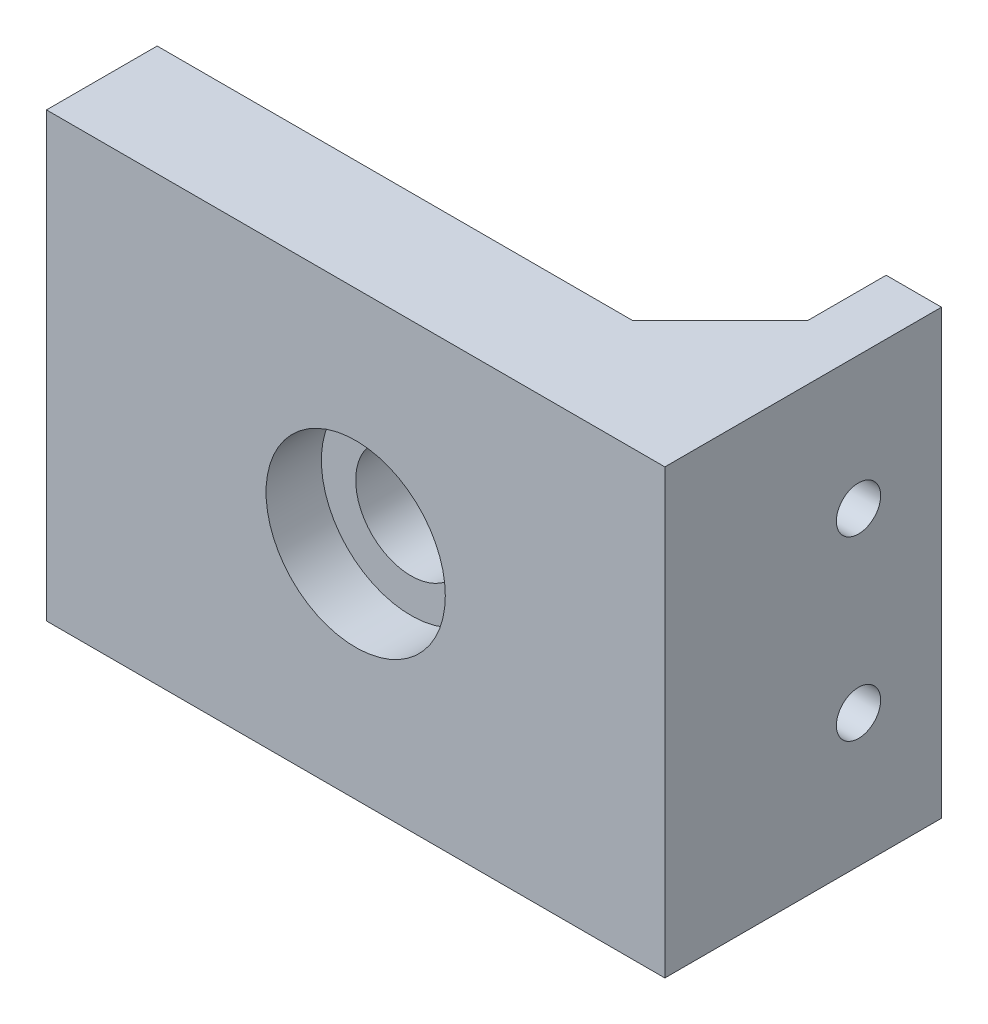
ISO-10303-21;
HEADER;
FILE_DESCRIPTION(('STEP AP214'),'2;1');
FILE_NAME('part.step','',(''),(''),'','','');
FILE_SCHEMA(('AUTOMOTIVE_DESIGN { 1 0 10303 214 1 1 1 1 }'));
ENDSEC;
DATA;
#1=APPLICATION_CONTEXT('core data for automotive mechanical design processes');
#2=APPLICATION_PROTOCOL_DEFINITION('international standard','automotive_design',2000,#1);
#3=PRODUCT_CONTEXT('',#1,'mechanical');
#4=PRODUCT('Part','Part','',(#3));
#5=PRODUCT_RELATED_PRODUCT_CATEGORY('part','',(#4));
#6=PRODUCT_DEFINITION_FORMATION('','',#4);
#7=PRODUCT_DEFINITION_CONTEXT('part definition',#1,'design');
#8=PRODUCT_DEFINITION('design','',#6,#7);
#9=PRODUCT_DEFINITION_SHAPE('','',#8);
#10=(LENGTH_UNIT() NAMED_UNIT(*) SI_UNIT(.MILLI.,.METRE.));
#11=(NAMED_UNIT(*) PLANE_ANGLE_UNIT() SI_UNIT($,.RADIAN.));
#12=(NAMED_UNIT(*) SI_UNIT($,.STERADIAN.) SOLID_ANGLE_UNIT());
#13=UNCERTAINTY_MEASURE_WITH_UNIT(LENGTH_MEASURE(1.E-05),#10,'distance_accuracy_value','');
#14=(GEOMETRIC_REPRESENTATION_CONTEXT(3) GLOBAL_UNCERTAINTY_ASSIGNED_CONTEXT((#13)) GLOBAL_UNIT_ASSIGNED_CONTEXT((#10,
#11,#12)) REPRESENTATION_CONTEXT('',''));
#15=CARTESIAN_POINT('',(0.,0.,0.));
#16=DIRECTION('',(0.,0.,1.));
#17=DIRECTION('',(1.,0.,0.));
#18=AXIS2_PLACEMENT_3D('',#15,#16,#17);
#19=CARTESIAN_POINT('',(0.,0.,0.));
#20=DIRECTION('',(0.,0.,1.));
#21=DIRECTION('',(1.,0.,0.));
#22=AXIS2_PLACEMENT_3D('',#19,#20,#21);
#23=PLANE('',#22);
#24=CARTESIAN_POINT('',(0.,0.,0.));
#25=DIRECTION('',(0.,0.,1.));
#26=DIRECTION('',(1.,0.,0.));
#27=AXIS2_PLACEMENT_3D('',#24,#25,#26);
#28=CIRCLE('',#27,5.);
#29=CARTESIAN_POINT('',(4.99999999999997,0.,0.));
#30=VERTEX_POINT('',#29);
#31=EDGE_CURVE('E167',#30,#30,#28,.T.);
#32=ORIENTED_EDGE('',*,*,#31,.T.);
#33=EDGE_LOOP('',(#32));
#34=FACE_BOUND('',#33,.T.);
#35=DIRECTION('',(1.,0.,0.));
#36=VECTOR('',#35,1.);
#37=CARTESIAN_POINT('',(0.,-15.,0.));
#38=LINE('',#37,#36);
#39=CARTESIAN_POINT('',(15.005364055125,-15.,0.));
#40=VERTEX_POINT('',#39);
#41=CARTESIAN_POINT('',(22.94,-15.,0.));
#42=VERTEX_POINT('',#41);
#43=EDGE_CURVE('E48',#40,#42,#38,.T.);
#44=ORIENTED_EDGE('',*,*,#43,.F.);
#45=DIRECTION('',(0.,-1.,0.));
#46=VECTOR('',#45,1.);
#47=CARTESIAN_POINT('',(15.005364055125,0.,0.));
#48=LINE('',#47,#46);
#49=CARTESIAN_POINT('',(15.005364055125,-20.,0.));
#50=VERTEX_POINT('',#49);
#51=EDGE_CURVE('E52',#40,#50,#48,.T.);
#52=ORIENTED_EDGE('',*,*,#51,.T.);
#53=DIRECTION('',(1.,0.,0.));
#54=VECTOR('',#53,1.);
#55=CARTESIAN_POINT('',(-27.94,-20.,0.));
#56=LINE('',#55,#54);
#57=CARTESIAN_POINT('',(-27.94,-20.,0.));
#58=VERTEX_POINT('',#57);
#59=EDGE_CURVE('E174',#58,#50,#56,.T.);
#60=ORIENTED_EDGE('',*,*,#59,.F.);
#61=DIRECTION('',(0.,-1.,0.));
#62=VECTOR('',#61,1.);
#63=CARTESIAN_POINT('',(-27.94,20.,0.));
#64=LINE('',#63,#62);
#65=CARTESIAN_POINT('',(-27.94,20.,0.));
#66=VERTEX_POINT('',#65);
#67=EDGE_CURVE('E182',#66,#58,#64,.T.);
#68=ORIENTED_EDGE('',*,*,#67,.F.);
#69=DIRECTION('',(-1.,0.,0.));
#70=VECTOR('',#69,1.);
#71=CARTESIAN_POINT('',(-27.94,20.,0.));
#72=LINE('',#71,#70);
#73=CARTESIAN_POINT('',(15.005364055125,20.,0.));
#74=VERTEX_POINT('',#73);
#75=EDGE_CURVE('E170',#74,#66,#72,.T.);
#76=ORIENTED_EDGE('',*,*,#75,.F.);
#77=DIRECTION('',(0.,1.,0.));
#78=VECTOR('',#77,1.);
#79=CARTESIAN_POINT('',(15.005364055125,0.,0.));
#80=LINE('',#79,#78);
#81=CARTESIAN_POINT('',(15.005364055125,15.,0.));
#82=VERTEX_POINT('',#81);
#83=EDGE_CURVE('E142',#74,#82,#80,.F.);
#84=ORIENTED_EDGE('',*,*,#83,.T.);
#85=DIRECTION('',(-1.,0.,0.));
#86=VECTOR('',#85,1.);
#87=CARTESIAN_POINT('',(0.,15.,0.));
#88=LINE('',#87,#86);
#89=CARTESIAN_POINT('',(22.94,15.,0.));
#90=VERTEX_POINT('',#89);
#91=EDGE_CURVE('E137',#90,#82,#88,.T.);
#92=ORIENTED_EDGE('',*,*,#91,.F.);
#93=DIRECTION('',(0.,1.,0.));
#94=VECTOR('',#93,1.);
#95=CARTESIAN_POINT('',(22.94,20.,0.));
#96=LINE('',#95,#94);
#97=EDGE_CURVE('E144',#42,#90,#96,.T.);
#98=ORIENTED_EDGE('',*,*,#97,.F.);
#99=EDGE_LOOP('',(#44,#52,#60,#68,#76,#84,#92,#98));
#100=FACE_BOUND('',#99,.T.);
#101=ADVANCED_FACE('F33',(#34,#100),#23,.F.);
#102=CARTESIAN_POINT('',(0.,0.,10.));
#103=DIRECTION('',(0.,0.,-1.));
#104=DIRECTION('',(-1.,0.,0.));
#105=AXIS2_PLACEMENT_3D('',#102,#103,#104);
#106=CYLINDRICAL_SURFACE('',#105,5.);
#107=ORIENTED_EDGE('',*,*,#31,.F.);
#108=EDGE_LOOP('',(#107));
#109=FACE_BOUND('',#108,.T.);
#110=CARTESIAN_POINT('',(0.,0.,5.));
#111=DIRECTION('',(0.,0.,1.));
#112=DIRECTION('',(1.,0.,0.));
#113=AXIS2_PLACEMENT_3D('',#110,#111,#112);
#114=CIRCLE('',#113,5.);
#115=CARTESIAN_POINT('',(4.99999999999997,0.,5.));
#116=VERTEX_POINT('',#115);
#117=EDGE_CURVE('E164',#116,#116,#114,.T.);
#118=ORIENTED_EDGE('',*,*,#117,.T.);
#119=EDGE_LOOP('',(#118));
#120=FACE_BOUND('',#119,.T.);
#121=ADVANCED_FACE('F223',(#109,#120),#106,.F.);
#122=CARTESIAN_POINT('',(0.,0.,10.));
#123=DIRECTION('',(0.,0.,1.));
#124=DIRECTION('',(1.,0.,0.));
#125=AXIS2_PLACEMENT_3D('',#122,#123,#124);
#126=PLANE('',#125);
#127=DIRECTION('',(1.,0.,0.));
#128=VECTOR('',#127,1.);
#129=CARTESIAN_POINT('',(-27.94,-20.,10.));
#130=LINE('',#129,#128);
#131=CARTESIAN_POINT('',(-27.94,-20.,10.));
#132=VERTEX_POINT('',#131);
#133=CARTESIAN_POINT('',(27.94,-20.,10.));
#134=VERTEX_POINT('',#133);
#135=EDGE_CURVE('E178',#132,#134,#130,.T.);
#136=ORIENTED_EDGE('',*,*,#135,.T.);
#137=DIRECTION('',(0.,1.,0.));
#138=VECTOR('',#137,1.);
#139=CARTESIAN_POINT('',(27.94,20.,10.));
#140=LINE('',#139,#138);
#141=CARTESIAN_POINT('',(27.94,20.,10.));
#142=VERTEX_POINT('',#141);
#143=EDGE_CURVE('E171',#134,#142,#140,.T.);
#144=ORIENTED_EDGE('',*,*,#143,.T.);
#145=DIRECTION('',(-1.,0.,0.));
#146=VECTOR('',#145,1.);
#147=CARTESIAN_POINT('',(-27.94,20.,10.));
#148=LINE('',#147,#146);
#149=CARTESIAN_POINT('',(-27.94,20.,10.));
#150=VERTEX_POINT('',#149);
#151=EDGE_CURVE('E173',#142,#150,#148,.T.);
#152=ORIENTED_EDGE('',*,*,#151,.T.);
#153=DIRECTION('',(0.,-1.,0.));
#154=VECTOR('',#153,1.);
#155=CARTESIAN_POINT('',(-27.94,20.,10.));
#156=LINE('',#155,#154);
#157=EDGE_CURVE('E176',#150,#132,#156,.T.);
#158=ORIENTED_EDGE('',*,*,#157,.T.);
#159=EDGE_LOOP('',(#136,#144,#152,#158));
#160=FACE_BOUND('',#159,.T.);
#161=CARTESIAN_POINT('',(0.,0.,10.));
#162=DIRECTION('',(0.,0.,1.));
#163=DIRECTION('',(1.,0.,0.));
#164=AXIS2_PLACEMENT_3D('',#161,#162,#163);
#165=CIRCLE('',#164,8.1);
#166=CARTESIAN_POINT('',(8.09999999999997,0.,10.));
#167=VERTEX_POINT('',#166);
#168=EDGE_CURVE('E160',#167,#167,#165,.T.);
#169=ORIENTED_EDGE('',*,*,#168,.F.);
#170=EDGE_LOOP('',(#169));
#171=FACE_BOUND('',#170,.T.);
#172=ADVANCED_FACE('F229',(#160,#171),#126,.T.);
#173=CARTESIAN_POINT('',(27.94,20.,10.));
#174=DIRECTION('',(-1.,0.,0.));
#175=DIRECTION('',(0.,0.,1.));
#176=AXIS2_PLACEMENT_3D('',#173,#174,#175);
#177=PLANE('',#176);
#178=CARTESIAN_POINT('',(27.94,8.,-7.5));
#179=DIRECTION('',(-1.,0.,0.));
#180=DIRECTION('',(0.,0.,1.));
#181=AXIS2_PLACEMENT_3D('',#178,#179,#180);
#182=CIRCLE('',#181,2.);
#183=CARTESIAN_POINT('',(27.94,8.,-5.5));
#184=VERTEX_POINT('',#183);
#185=EDGE_CURVE('E124',#184,#184,#182,.T.);
#186=ORIENTED_EDGE('',*,*,#185,.T.);
#187=EDGE_LOOP('',(#186));
#188=FACE_BOUND('',#187,.T.);
#189=CARTESIAN_POINT('',(27.94,-8.,-7.49999999999999));
#190=DIRECTION('',(-1.,0.,0.));
#191=DIRECTION('',(0.,0.,1.));
#192=AXIS2_PLACEMENT_3D('',#189,#190,#191);
#193=CIRCLE('',#192,2.);
#194=CARTESIAN_POINT('',(27.94,-8.,-5.49999999999999));
#195=VERTEX_POINT('',#194);
#196=EDGE_CURVE('E128',#195,#195,#193,.T.);
#197=ORIENTED_EDGE('',*,*,#196,.T.);
#198=EDGE_LOOP('',(#197));
#199=FACE_BOUND('',#198,.T.);
#200=DIRECTION('',(0.,0.,-1.));
#201=VECTOR('',#200,1.);
#202=CARTESIAN_POINT('',(27.94,-20.,10.));
#203=LINE('',#202,#201);
#204=CARTESIAN_POINT('',(27.94,-20.,-15.));
#205=VERTEX_POINT('',#204);
#206=EDGE_CURVE('E180',#134,#205,#203,.T.);
#207=ORIENTED_EDGE('',*,*,#206,.T.);
#208=DIRECTION('',(0.,-1.,0.));
#209=VECTOR('',#208,1.);
#210=CARTESIAN_POINT('',(27.94,20.,-15.));
#211=LINE('',#210,#209);
#212=CARTESIAN_POINT('',(27.94,20.,-15.));
#213=VERTEX_POINT('',#212);
#214=EDGE_CURVE('E145',#213,#205,#211,.T.);
#215=ORIENTED_EDGE('',*,*,#214,.F.);
#216=DIRECTION('',(0.,0.,-1.));
#217=VECTOR('',#216,1.);
#218=CARTESIAN_POINT('',(27.94,20.,10.));
#219=LINE('',#218,#217);
#220=EDGE_CURVE('E192',#142,#213,#219,.T.);
#221=ORIENTED_EDGE('',*,*,#220,.F.);
#222=ORIENTED_EDGE('',*,*,#143,.F.);
#223=EDGE_LOOP('',(#207,#215,#221,#222));
#224=FACE_BOUND('',#223,.T.);
#225=ADVANCED_FACE('F35',(#188,#199,#224),#177,.F.);
#226=CARTESIAN_POINT('',(-27.94,20.,10.));
#227=DIRECTION('',(0.,-1.,0.));
#228=DIRECTION('',(0.,0.,-1.));
#229=AXIS2_PLACEMENT_3D('',#226,#227,#228);
#230=PLANE('',#229);
#231=DIRECTION('',(0.707106781186544,0.,-0.707106781186551));
#232=VECTOR('',#231,1.);
#233=CARTESIAN_POINT('',(15.005364055125,20.,0.));
#234=LINE('',#233,#232);
#235=CARTESIAN_POINT('',(22.94,20.,-7.93463594487504));
#236=VERTEX_POINT('',#235);
#237=EDGE_CURVE('E134',#74,#236,#234,.T.);
#238=ORIENTED_EDGE('',*,*,#237,.F.);
#239=ORIENTED_EDGE('',*,*,#75,.T.);
#240=DIRECTION('',(0.,0.,-1.));
#241=VECTOR('',#240,1.);
#242=CARTESIAN_POINT('',(-27.94,20.,10.));
#243=LINE('',#242,#241);
#244=EDGE_CURVE('E189',#150,#66,#243,.T.);
#245=ORIENTED_EDGE('',*,*,#244,.F.);
#246=ORIENTED_EDGE('',*,*,#151,.F.);
#247=ORIENTED_EDGE('',*,*,#220,.T.);
#248=DIRECTION('',(1.,0.,0.));
#249=VECTOR('',#248,1.);
#250=CARTESIAN_POINT('',(27.94,20.,-15.));
#251=LINE('',#250,#249);
#252=CARTESIAN_POINT('',(22.94,20.,-15.));
#253=VERTEX_POINT('',#252);
#254=EDGE_CURVE('E152',#253,#213,#251,.T.);
#255=ORIENTED_EDGE('',*,*,#254,.F.);
#256=DIRECTION('',(0.,0.,1.));
#257=VECTOR('',#256,1.);
#258=CARTESIAN_POINT('',(22.94,20.,-15.));
#259=LINE('',#258,#257);
#260=EDGE_CURVE('E155',#253,#236,#259,.T.);
#261=ORIENTED_EDGE('',*,*,#260,.T.);
#262=EDGE_LOOP('',(#238,#239,#245,#246,#247,#255,#261));
#263=FACE_BOUND('',#262,.T.);
#264=ADVANCED_FACE('F206',(#263),#230,.F.);
#265=CARTESIAN_POINT('',(-27.94,20.,10.));
#266=DIRECTION('',(1.,0.,0.));
#267=DIRECTION('',(0.,1.,0.));
#268=AXIS2_PLACEMENT_3D('',#265,#266,#267);
#269=PLANE('',#268);
#270=ORIENTED_EDGE('',*,*,#67,.T.);
#271=DIRECTION('',(0.,0.,-1.));
#272=VECTOR('',#271,1.);
#273=CARTESIAN_POINT('',(-27.94,-20.,10.));
#274=LINE('',#273,#272);
#275=EDGE_CURVE('E186',#132,#58,#274,.T.);
#276=ORIENTED_EDGE('',*,*,#275,.F.);
#277=ORIENTED_EDGE('',*,*,#157,.F.);
#278=ORIENTED_EDGE('',*,*,#244,.T.);
#279=EDGE_LOOP('',(#270,#276,#277,#278));
#280=FACE_BOUND('',#279,.T.);
#281=ADVANCED_FACE('F238',(#280),#269,.F.);
#282=CARTESIAN_POINT('',(-27.94,-20.,10.));
#283=DIRECTION('',(0.,1.,0.));
#284=DIRECTION('',(0.,0.,1.));
#285=AXIS2_PLACEMENT_3D('',#282,#283,#284);
#286=PLANE('',#285);
#287=ORIENTED_EDGE('',*,*,#206,.F.);
#288=ORIENTED_EDGE('',*,*,#135,.F.);
#289=ORIENTED_EDGE('',*,*,#275,.T.);
#290=ORIENTED_EDGE('',*,*,#59,.T.);
#291=DIRECTION('',(0.707106781186544,0.,-0.707106781186551));
#292=VECTOR('',#291,1.);
#293=CARTESIAN_POINT('',(15.005364055125,-20.,0.));
#294=LINE('',#293,#292);
#295=CARTESIAN_POINT('',(22.94,-20.,-7.93463594487504));
#296=VERTEX_POINT('',#295);
#297=EDGE_CURVE('E123',#50,#296,#294,.T.);
#298=ORIENTED_EDGE('',*,*,#297,.T.);
#299=DIRECTION('',(0.,0.,1.));
#300=VECTOR('',#299,1.);
#301=CARTESIAN_POINT('',(22.94,-20.,-15.));
#302=LINE('',#301,#300);
#303=CARTESIAN_POINT('',(22.94,-20.,-15.));
#304=VERTEX_POINT('',#303);
#305=EDGE_CURVE('E112',#304,#296,#302,.T.);
#306=ORIENTED_EDGE('',*,*,#305,.F.);
#307=DIRECTION('',(-1.,0.,0.));
#308=VECTOR('',#307,1.);
#309=CARTESIAN_POINT('',(27.94,-20.,-15.));
#310=LINE('',#309,#308);
#311=EDGE_CURVE('E148',#205,#304,#310,.T.);
#312=ORIENTED_EDGE('',*,*,#311,.F.);
#313=EDGE_LOOP('',(#287,#288,#289,#290,#298,#306,#312));
#314=FACE_BOUND('',#313,.T.);
#315=ADVANCED_FACE('F234',(#314),#286,.F.);
#316=CARTESIAN_POINT('',(0.,0.,5.));
#317=DIRECTION('',(0.,0.,1.));
#318=DIRECTION('',(1.,0.,0.));
#319=AXIS2_PLACEMENT_3D('',#316,#317,#318);
#320=CYLINDRICAL_SURFACE('',#319,8.1);
#321=CARTESIAN_POINT('',(0.,0.,5.));
#322=DIRECTION('',(0.,0.,1.));
#323=DIRECTION('',(1.,0.,0.));
#324=AXIS2_PLACEMENT_3D('',#321,#322,#323);
#325=CIRCLE('',#324,8.1);
#326=CARTESIAN_POINT('',(8.09999999999997,0.,5.));
#327=VERTEX_POINT('',#326);
#328=EDGE_CURVE('E161',#327,#327,#325,.T.);
#329=ORIENTED_EDGE('',*,*,#328,.F.);
#330=EDGE_LOOP('',(#329));
#331=FACE_BOUND('',#330,.T.);
#332=ORIENTED_EDGE('',*,*,#168,.T.);
#333=EDGE_LOOP('',(#332));
#334=FACE_BOUND('',#333,.T.);
#335=ADVANCED_FACE('F237',(#331,#334),#320,.F.);
#336=CARTESIAN_POINT('',(0.,0.,5.));
#337=DIRECTION('',(0.,0.,1.));
#338=DIRECTION('',(1.,0.,0.));
#339=AXIS2_PLACEMENT_3D('',#336,#337,#338);
#340=PLANE('',#339);
#341=ORIENTED_EDGE('',*,*,#117,.F.);
#342=EDGE_LOOP('',(#341));
#343=FACE_BOUND('',#342,.T.);
#344=ORIENTED_EDGE('',*,*,#328,.T.);
#345=EDGE_LOOP('',(#344));
#346=FACE_BOUND('',#345,.T.);
#347=ADVANCED_FACE('F268',(#343,#346),#340,.T.);
#348=CARTESIAN_POINT('',(22.94,20.,-15.));
#349=DIRECTION('',(1.,0.,0.));
#350=DIRECTION('',(0.,1.,0.));
#351=AXIS2_PLACEMENT_3D('',#348,#349,#350);
#352=PLANE('',#351);
#353=CARTESIAN_POINT('',(22.94,8.,-7.5));
#354=DIRECTION('',(-1.,0.,0.));
#355=DIRECTION('',(0.,-1.,0.));
#356=AXIS2_PLACEMENT_3D('',#353,#354,#355);
#357=CIRCLE('',#356,2.);
#358=CARTESIAN_POINT('',(22.94,6.,-7.5));
#359=VERTEX_POINT('',#358);
#360=EDGE_CURVE('E402',#359,#359,#357,.T.);
#361=ORIENTED_EDGE('',*,*,#360,.F.);
#362=EDGE_LOOP('',(#361));
#363=FACE_BOUND('',#362,.T.);
#364=CARTESIAN_POINT('',(22.94,-8.,-7.49999999999999));
#365=DIRECTION('',(-1.,0.,0.));
#366=DIRECTION('',(0.,1.,0.));
#367=AXIS2_PLACEMENT_3D('',#364,#365,#366);
#368=CIRCLE('',#367,2.);
#369=CARTESIAN_POINT('',(22.94,-6.,-7.49999999999999));
#370=VERTEX_POINT('',#369);
#371=EDGE_CURVE('E403',#370,#370,#368,.T.);
#372=ORIENTED_EDGE('',*,*,#371,.F.);
#373=EDGE_LOOP('',(#372));
#374=FACE_BOUND('',#373,.T.);
#375=ORIENTED_EDGE('',*,*,#305,.T.);
#376=DIRECTION('',(0.,1.,0.));
#377=VECTOR('',#376,1.);
#378=CARTESIAN_POINT('',(22.94,20.,-7.93463594487504));
#379=LINE('',#378,#377);
#380=CARTESIAN_POINT('',(22.94,-15.,-7.93463594487504));
#381=VERTEX_POINT('',#380);
#382=EDGE_CURVE('E11',#296,#381,#379,.T.);
#383=ORIENTED_EDGE('',*,*,#382,.T.);
#384=DIRECTION('',(0.,0.,-1.));
#385=VECTOR('',#384,1.);
#386=CARTESIAN_POINT('',(22.94,-15.,-15.));
#387=LINE('',#386,#385);
#388=EDGE_CURVE('E41',#42,#381,#387,.T.);
#389=ORIENTED_EDGE('',*,*,#388,.F.);
#390=ORIENTED_EDGE('',*,*,#97,.T.);
#391=DIRECTION('',(0.,0.,1.));
#392=VECTOR('',#391,1.);
#393=CARTESIAN_POINT('',(22.94,15.,-15.));
#394=LINE('',#393,#392);
#395=CARTESIAN_POINT('',(22.94,15.,-7.93463594487504));
#396=VERTEX_POINT('',#395);
#397=EDGE_CURVE('E194',#396,#90,#394,.T.);
#398=ORIENTED_EDGE('',*,*,#397,.F.);
#399=DIRECTION('',(0.,-1.,0.));
#400=VECTOR('',#399,1.);
#401=CARTESIAN_POINT('',(22.94,20.,-7.93463594487504));
#402=LINE('',#401,#400);
#403=EDGE_CURVE('E121',#396,#236,#402,.F.);
#404=ORIENTED_EDGE('',*,*,#403,.T.);
#405=ORIENTED_EDGE('',*,*,#260,.F.);
#406=DIRECTION('',(0.,1.,0.));
#407=VECTOR('',#406,1.);
#408=CARTESIAN_POINT('',(22.94,20.,-15.));
#409=LINE('',#408,#407);
#410=EDGE_CURVE('E150',#304,#253,#409,.T.);
#411=ORIENTED_EDGE('',*,*,#410,.F.);
#412=EDGE_LOOP('',(#375,#383,#389,#390,#398,#404,#405,#411));
#413=FACE_BOUND('',#412,.T.);
#414=ADVANCED_FACE('F109',(#363,#374,#413),#352,.F.);
#415=CARTESIAN_POINT('',(0.,0.,-15.));
#416=DIRECTION('',(0.,0.,-1.));
#417=DIRECTION('',(-1.,0.,0.));
#418=AXIS2_PLACEMENT_3D('',#415,#416,#417);
#419=PLANE('',#418);
#420=ORIENTED_EDGE('',*,*,#214,.T.);
#421=ORIENTED_EDGE('',*,*,#311,.T.);
#422=ORIENTED_EDGE('',*,*,#410,.T.);
#423=ORIENTED_EDGE('',*,*,#254,.T.);
#424=EDGE_LOOP('',(#420,#421,#422,#423));
#425=FACE_BOUND('',#424,.T.);
#426=ADVANCED_FACE('F220',(#425),#419,.T.);
#427=CARTESIAN_POINT('',(15.005364055125,20.,0.));
#428=DIRECTION('',(0.707106781186551,0.,0.707106781186544));
#429=DIRECTION('',(0.707106781186544,0.,-0.707106781186551));
#430=AXIS2_PLACEMENT_3D('',#427,#428,#429);
#431=PLANE('',#430);
#432=ORIENTED_EDGE('',*,*,#83,.F.);
#433=ORIENTED_EDGE('',*,*,#237,.T.);
#434=ORIENTED_EDGE('',*,*,#403,.F.);
#435=DIRECTION('',(0.707106781186544,0.,-0.707106781186551));
#436=VECTOR('',#435,1.);
#437=CARTESIAN_POINT('',(15.005364055125,15.,0.));
#438=LINE('',#437,#436);
#439=EDGE_CURVE('E133',#82,#396,#438,.T.);
#440=ORIENTED_EDGE('',*,*,#439,.F.);
#441=EDGE_LOOP('',(#432,#433,#434,#440));
#442=FACE_BOUND('',#441,.T.);
#443=ADVANCED_FACE('F208',(#442),#431,.F.);
#444=CARTESIAN_POINT('',(0.,15.,-2.5));
#445=DIRECTION('',(0.,1.,0.));
#446=DIRECTION('',(0.,0.,1.));
#447=AXIS2_PLACEMENT_3D('',#444,#445,#446);
#448=PLANE('',#447);
#449=ORIENTED_EDGE('',*,*,#397,.T.);
#450=ORIENTED_EDGE('',*,*,#91,.T.);
#451=ORIENTED_EDGE('',*,*,#439,.T.);
#452=EDGE_LOOP('',(#449,#450,#451));
#453=FACE_BOUND('',#452,.T.);
#454=ADVANCED_FACE('F212',(#453),#448,.F.);
#455=CARTESIAN_POINT('',(15.005364055125,-20.,0.));
#456=DIRECTION('',(-0.707106781186551,0.,-0.707106781186544));
#457=DIRECTION('',(0.707106781186544,0.,-0.707106781186551));
#458=AXIS2_PLACEMENT_3D('',#455,#456,#457);
#459=PLANE('',#458);
#460=ORIENTED_EDGE('',*,*,#51,.F.);
#461=DIRECTION('',(0.707106781186544,0.,-0.707106781186551));
#462=VECTOR('',#461,1.);
#463=CARTESIAN_POINT('',(15.005364055125,-15.,0.));
#464=LINE('',#463,#462);
#465=EDGE_CURVE('E120',#40,#381,#464,.T.);
#466=ORIENTED_EDGE('',*,*,#465,.T.);
#467=ORIENTED_EDGE('',*,*,#382,.F.);
#468=ORIENTED_EDGE('',*,*,#297,.F.);
#469=EDGE_LOOP('',(#460,#466,#467,#468));
#470=FACE_BOUND('',#469,.T.);
#471=ADVANCED_FACE('F122',(#470),#459,.T.);
#472=CARTESIAN_POINT('',(0.,-15.,-2.5));
#473=DIRECTION('',(0.,-1.,0.));
#474=DIRECTION('',(0.,0.,-1.));
#475=AXIS2_PLACEMENT_3D('',#472,#473,#474);
#476=PLANE('',#475);
#477=ORIENTED_EDGE('',*,*,#465,.F.);
#478=ORIENTED_EDGE('',*,*,#43,.T.);
#479=ORIENTED_EDGE('',*,*,#388,.T.);
#480=EDGE_LOOP('',(#477,#478,#479));
#481=FACE_BOUND('',#480,.T.);
#482=ADVANCED_FACE('F119',(#481),#476,.F.);
#483=CARTESIAN_POINT('',(37.94,-8.,-7.49999999999999));
#484=DIRECTION('',(-1.,0.,0.));
#485=DIRECTION('',(0.,-1.,0.));
#486=AXIS2_PLACEMENT_3D('',#483,#484,#485);
#487=CYLINDRICAL_SURFACE('',#486,2.);
#488=ORIENTED_EDGE('',*,*,#371,.T.);
#489=EDGE_LOOP('',(#488));
#490=FACE_BOUND('',#489,.T.);
#491=ORIENTED_EDGE('',*,*,#196,.F.);
#492=EDGE_LOOP('',(#491));
#493=FACE_BOUND('',#492,.T.);
#494=ADVANCED_FACE('F305',(#490,#493),#487,.F.);
#495=CARTESIAN_POINT('',(37.94,8.,-7.5));
#496=DIRECTION('',(-1.,0.,0.));
#497=DIRECTION('',(0.,-1.,0.));
#498=AXIS2_PLACEMENT_3D('',#495,#496,#497);
#499=CYLINDRICAL_SURFACE('',#498,2.);
#500=ORIENTED_EDGE('',*,*,#360,.T.);
#501=EDGE_LOOP('',(#500));
#502=FACE_BOUND('',#501,.T.);
#503=ORIENTED_EDGE('',*,*,#185,.F.);
#504=EDGE_LOOP('',(#503));
#505=FACE_BOUND('',#504,.T.);
#506=ADVANCED_FACE('F310',(#502,#505),#499,.F.);
#507=CLOSED_SHELL('',(#101,#121,#172,#225,#264,#281,#315,#335,#347,#414,#426,#443,#454,#471,
#482,#494,#506));
#508=MANIFOLD_SOLID_BREP('B2',#507);
#509=ADVANCED_BREP_SHAPE_REPRESENTATION('',(#18,#508),#14);
#510=SHAPE_DEFINITION_REPRESENTATION(#9,#509);
ENDSEC;
END-ISO-10303-21;
